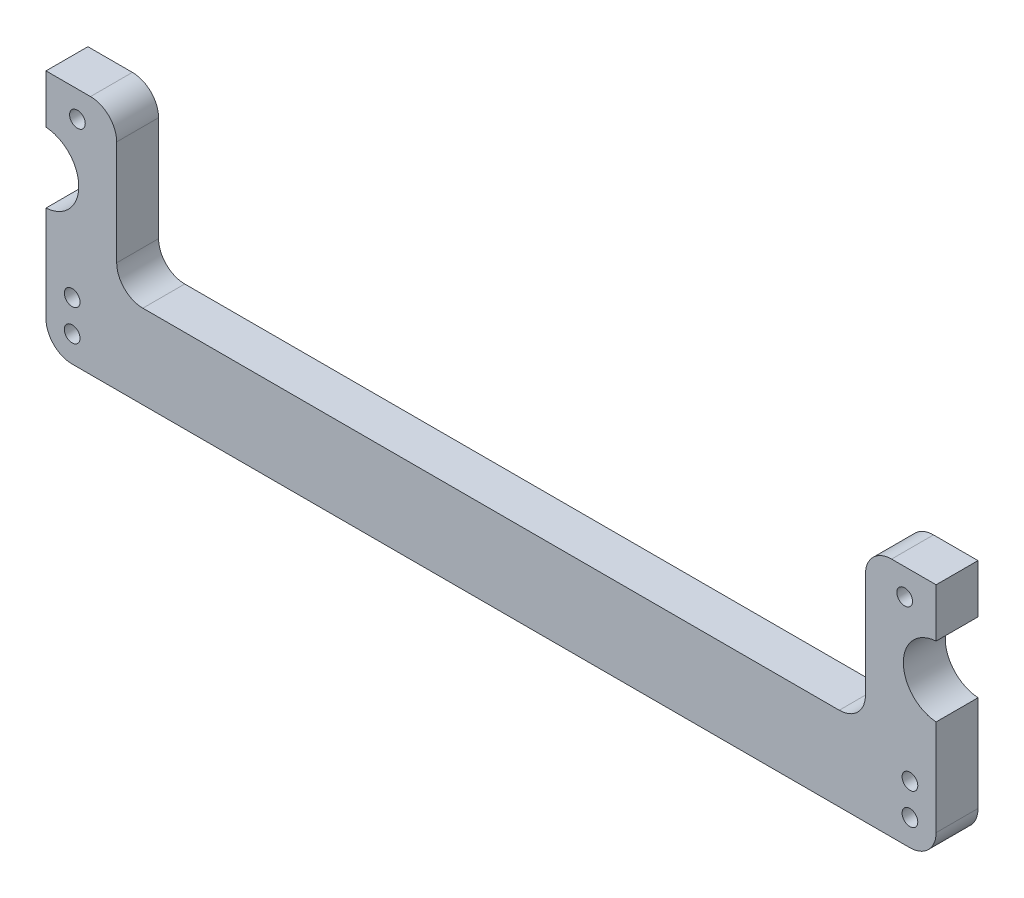
ISO-10303-21;
HEADER;
FILE_DESCRIPTION(('STEP AP214'),'2;1');
FILE_NAME('part.step','',(''),(''),'','','');
FILE_SCHEMA(('AUTOMOTIVE_DESIGN { 1 0 10303 214 1 1 1 1 }'));
ENDSEC;
DATA;
#1=APPLICATION_CONTEXT('core data for automotive mechanical design processes');
#2=APPLICATION_PROTOCOL_DEFINITION('international standard','automotive_design',2000,#1);
#3=PRODUCT_CONTEXT('',#1,'mechanical');
#4=PRODUCT('Part','Part','',(#3));
#5=PRODUCT_RELATED_PRODUCT_CATEGORY('part','',(#4));
#6=PRODUCT_DEFINITION_FORMATION('','',#4);
#7=PRODUCT_DEFINITION_CONTEXT('part definition',#1,'design');
#8=PRODUCT_DEFINITION('design','',#6,#7);
#9=PRODUCT_DEFINITION_SHAPE('','',#8);
#10=(LENGTH_UNIT() NAMED_UNIT(*) SI_UNIT(.MILLI.,.METRE.));
#11=(NAMED_UNIT(*) PLANE_ANGLE_UNIT() SI_UNIT($,.RADIAN.));
#12=(NAMED_UNIT(*) SI_UNIT($,.STERADIAN.) SOLID_ANGLE_UNIT());
#13=UNCERTAINTY_MEASURE_WITH_UNIT(LENGTH_MEASURE(1.E-05),#10,'distance_accuracy_value','');
#14=(GEOMETRIC_REPRESENTATION_CONTEXT(3) GLOBAL_UNCERTAINTY_ASSIGNED_CONTEXT((#13)) GLOBAL_UNIT_ASSIGNED_CONTEXT((#10,
#11,#12)) REPRESENTATION_CONTEXT('',''));
#15=CARTESIAN_POINT('',(0.,0.,0.));
#16=DIRECTION('',(0.,0.,1.));
#17=DIRECTION('',(1.,0.,0.));
#18=AXIS2_PLACEMENT_3D('',#15,#16,#17);
#19=CARTESIAN_POINT('',(0.,5.00000000000004,8.));
#20=DIRECTION('',(1.,0.,0.));
#21=DIRECTION('',(0.,0.,-1.));
#22=AXIS2_PLACEMENT_3D('',#19,#20,#21);
#23=PLANE('',#22);
#24=DIRECTION('',(0.,-1.,0.));
#25=VECTOR('',#24,1.);
#26=CARTESIAN_POINT('',(0.,5.00000000000004,0.));
#27=LINE('',#26,#25);
#28=CARTESIAN_POINT('',(0.,46.,0.));
#29=VERTEX_POINT('',#28);
#30=CARTESIAN_POINT('',(0.,36.6855366276759,0.));
#31=VERTEX_POINT('',#30);
#32=EDGE_CURVE('E215',#29,#31,#27,.T.);
#33=ORIENTED_EDGE('',*,*,#32,.T.);
#34=DIRECTION('',(0.,0.,1.));
#35=VECTOR('',#34,1.);
#36=CARTESIAN_POINT('',(0.,36.6855366276759,0.));
#37=LINE('',#36,#35);
#38=CARTESIAN_POINT('',(0.,36.6855366276759,8.));
#39=VERTEX_POINT('',#38);
#40=EDGE_CURVE('E11',#31,#39,#37,.T.);
#41=ORIENTED_EDGE('',*,*,#40,.T.);
#42=DIRECTION('',(0.,-1.,0.));
#43=VECTOR('',#42,1.);
#44=CARTESIAN_POINT('',(0.,16.,8.));
#45=LINE('',#44,#43);
#46=CARTESIAN_POINT('',(0.,46.,8.));
#47=VERTEX_POINT('',#46);
#48=EDGE_CURVE('E170',#47,#39,#45,.T.);
#49=ORIENTED_EDGE('',*,*,#48,.F.);
#50=DIRECTION('',(0.,0.,-1.));
#51=VECTOR('',#50,1.);
#52=CARTESIAN_POINT('',(0.,46.,8.));
#53=LINE('',#52,#51);
#54=EDGE_CURVE('E257',#47,#29,#53,.T.);
#55=ORIENTED_EDGE('',*,*,#54,.T.);
#56=EDGE_LOOP('',(#33,#41,#49,#55));
#57=FACE_BOUND('',#56,.T.);
#58=ADVANCED_FACE('F34',(#57),#23,.F.);
#59=CARTESIAN_POINT('',(170.,16.,8.));
#60=DIRECTION('',(-1.,0.,0.));
#61=DIRECTION('',(0.,0.,1.));
#62=AXIS2_PLACEMENT_3D('',#59,#60,#61);
#63=PLANE('',#62);
#64=DIRECTION('',(0.,1.,0.));
#65=VECTOR('',#64,1.);
#66=CARTESIAN_POINT('',(170.,16.,0.));
#67=LINE('',#66,#65);
#68=CARTESIAN_POINT('',(170.,5.00000000000004,0.));
#69=VERTEX_POINT('',#68);
#70=CARTESIAN_POINT('',(170.,23.3144633723235,0.));
#71=VERTEX_POINT('',#70);
#72=EDGE_CURVE('E226',#69,#71,#67,.T.);
#73=ORIENTED_EDGE('',*,*,#72,.T.);
#74=DIRECTION('',(0.,0.,1.));
#75=VECTOR('',#74,1.);
#76=CARTESIAN_POINT('',(170.,23.3144633723235,0.));
#77=LINE('',#76,#75);
#78=CARTESIAN_POINT('',(170.,23.3144633723235,8.));
#79=VERTEX_POINT('',#78);
#80=EDGE_CURVE('E162',#71,#79,#77,.T.);
#81=ORIENTED_EDGE('',*,*,#80,.T.);
#82=DIRECTION('',(0.,1.,0.));
#83=VECTOR('',#82,1.);
#84=CARTESIAN_POINT('',(170.,5.00000000000004,8.));
#85=LINE('',#84,#83);
#86=CARTESIAN_POINT('',(170.,5.00000000000004,8.));
#87=VERTEX_POINT('',#86);
#88=EDGE_CURVE('E189',#87,#79,#85,.T.);
#89=ORIENTED_EDGE('',*,*,#88,.F.);
#90=DIRECTION('',(0.,0.,-1.));
#91=VECTOR('',#90,1.);
#92=CARTESIAN_POINT('',(170.,5.00000000000004,8.));
#93=LINE('',#92,#91);
#94=EDGE_CURVE('E247',#87,#69,#93,.T.);
#95=ORIENTED_EDGE('',*,*,#94,.T.);
#96=EDGE_LOOP('',(#73,#81,#89,#95));
#97=FACE_BOUND('',#96,.T.);
#98=ADVANCED_FACE('F280',(#97),#63,.F.);
#99=CARTESIAN_POINT('',(151.5,21.,8.));
#100=DIRECTION('',(0.,0.,-1.));
#101=DIRECTION('',(-1.,0.,0.));
#102=AXIS2_PLACEMENT_3D('',#99,#100,#101);
#103=PLANE('',#102);
#104=CARTESIAN_POINT('',(6.,41.,8.));
#105=DIRECTION('',(0.,0.,1.));
#106=DIRECTION('',(1.,0.,0.));
#107=AXIS2_PLACEMENT_3D('',#104,#105,#106);
#108=CIRCLE('',#107,1.5);
#109=CARTESIAN_POINT('',(7.5,41.,8.));
#110=VERTEX_POINT('',#109);
#111=EDGE_CURVE('E309',#110,#110,#108,.T.);
#112=ORIENTED_EDGE('',*,*,#111,.F.);
#113=EDGE_LOOP('',(#112));
#114=FACE_BOUND('',#113,.T.);
#115=CARTESIAN_POINT('',(165.,5.,8.));
#116=DIRECTION('',(0.,0.,1.));
#117=DIRECTION('',(1.,0.,0.));
#118=AXIS2_PLACEMENT_3D('',#115,#116,#117);
#119=CIRCLE('',#118,1.5);
#120=CARTESIAN_POINT('',(166.5,5.,8.));
#121=VERTEX_POINT('',#120);
#122=EDGE_CURVE('E321',#121,#121,#119,.T.);
#123=ORIENTED_EDGE('',*,*,#122,.F.);
#124=EDGE_LOOP('',(#123));
#125=FACE_BOUND('',#124,.T.);
#126=CARTESIAN_POINT('',(5.,11.,8.));
#127=DIRECTION('',(0.,0.,1.));
#128=DIRECTION('',(1.,0.,0.));
#129=AXIS2_PLACEMENT_3D('',#126,#127,#128);
#130=CIRCLE('',#129,1.5);
#131=CARTESIAN_POINT('',(6.5,11.,8.));
#132=VERTEX_POINT('',#131);
#133=EDGE_CURVE('E203',#132,#132,#130,.T.);
#134=ORIENTED_EDGE('',*,*,#133,.F.);
#135=EDGE_LOOP('',(#134));
#136=FACE_BOUND('',#135,.T.);
#137=ORIENTED_EDGE('',*,*,#48,.T.);
#138=CARTESIAN_POINT('',(-0.440000000000183,29.9999999999997,8.));
#139=DIRECTION('',(0.,0.,1.));
#140=DIRECTION('',(1.,0.,0.));
#141=AXIS2_PLACEMENT_3D('',#138,#139,#140);
#142=CIRCLE('',#141,6.70000000000001);
#143=CARTESIAN_POINT('',(0.,23.3144633723235,8.));
#144=VERTEX_POINT('',#143);
#145=EDGE_CURVE('E158',#144,#39,#142,.T.);
#146=ORIENTED_EDGE('',*,*,#145,.F.);
#147=CARTESIAN_POINT('',(0.,5.00000000000004,8.));
#148=VERTEX_POINT('',#147);
#149=EDGE_CURVE('E167',#144,#148,#45,.T.);
#150=ORIENTED_EDGE('',*,*,#149,.T.);
#151=CARTESIAN_POINT('',(5.,5.,8.));
#152=DIRECTION('',(0.,0.,1.));
#153=DIRECTION('',(-1.,0.,0.));
#154=AXIS2_PLACEMENT_3D('',#151,#152,#153);
#155=CIRCLE('',#154,5.);
#156=CARTESIAN_POINT('',(5.00000000000004,0.,8.));
#157=VERTEX_POINT('',#156);
#158=EDGE_CURVE('E178',#148,#157,#155,.T.);
#159=ORIENTED_EDGE('',*,*,#158,.T.);
#160=DIRECTION('',(1.,0.,0.));
#161=VECTOR('',#160,1.);
#162=CARTESIAN_POINT('',(5.00000000000004,0.,8.));
#163=LINE('',#162,#161);
#164=CARTESIAN_POINT('',(165.,0.,8.));
#165=VERTEX_POINT('',#164);
#166=EDGE_CURVE('E184',#157,#165,#163,.T.);
#167=ORIENTED_EDGE('',*,*,#166,.T.);
#168=CARTESIAN_POINT('',(165.,5.,8.));
#169=DIRECTION('',(0.,0.,1.));
#170=DIRECTION('',(1.,0.,0.));
#171=AXIS2_PLACEMENT_3D('',#168,#169,#170);
#172=CIRCLE('',#171,5.);
#173=EDGE_CURVE('E186',#165,#87,#172,.T.);
#174=ORIENTED_EDGE('',*,*,#173,.T.);
#175=ORIENTED_EDGE('',*,*,#88,.T.);
#176=CARTESIAN_POINT('',(170.44,29.9999999999997,8.));
#177=DIRECTION('',(0.,0.,1.));
#178=DIRECTION('',(1.,0.,0.));
#179=AXIS2_PLACEMENT_3D('',#176,#177,#178);
#180=CIRCLE('',#179,6.69999999999999);
#181=CARTESIAN_POINT('',(170.,36.6855366276759,8.));
#182=VERTEX_POINT('',#181);
#183=EDGE_CURVE('E282',#182,#79,#180,.T.);
#184=ORIENTED_EDGE('',*,*,#183,.F.);
#185=CARTESIAN_POINT('',(170.,46.,8.));
#186=VERTEX_POINT('',#185);
#187=EDGE_CURVE('E188',#182,#186,#85,.T.);
#188=ORIENTED_EDGE('',*,*,#187,.T.);
#189=DIRECTION('',(-1.,0.,0.));
#190=VECTOR('',#189,1.);
#191=CARTESIAN_POINT('',(161.5,46.,8.));
#192=LINE('',#191,#190);
#193=CARTESIAN_POINT('',(161.5,46.,8.));
#194=VERTEX_POINT('',#193);
#195=EDGE_CURVE('E192',#186,#194,#192,.T.);
#196=ORIENTED_EDGE('',*,*,#195,.T.);
#197=CARTESIAN_POINT('',(161.5,41.,8.));
#198=DIRECTION('',(0.,0.,1.));
#199=DIRECTION('',(1.,0.,0.));
#200=AXIS2_PLACEMENT_3D('',#197,#198,#199);
#201=CIRCLE('',#200,5.);
#202=CARTESIAN_POINT('',(156.5,41.,8.));
#203=VERTEX_POINT('',#202);
#204=EDGE_CURVE('E194',#194,#203,#201,.T.);
#205=ORIENTED_EDGE('',*,*,#204,.T.);
#206=DIRECTION('',(0.,-1.,0.));
#207=VECTOR('',#206,1.);
#208=CARTESIAN_POINT('',(156.5,21.,8.));
#209=LINE('',#208,#207);
#210=CARTESIAN_POINT('',(156.5,21.,8.));
#211=VERTEX_POINT('',#210);
#212=EDGE_CURVE('E196',#203,#211,#209,.T.);
#213=ORIENTED_EDGE('',*,*,#212,.T.);
#214=CARTESIAN_POINT('',(151.5,21.,8.));
#215=DIRECTION('',(0.,0.,-1.));
#216=DIRECTION('',(-1.,0.,0.));
#217=AXIS2_PLACEMENT_3D('',#214,#215,#216);
#218=CIRCLE('',#217,5.);
#219=CARTESIAN_POINT('',(151.5,16.,8.));
#220=VERTEX_POINT('',#219);
#221=EDGE_CURVE('E235',#211,#220,#218,.T.);
#222=ORIENTED_EDGE('',*,*,#221,.T.);
#223=DIRECTION('',(-1.,0.,0.));
#224=VECTOR('',#223,1.);
#225=CARTESIAN_POINT('',(18.5,16.,8.));
#226=LINE('',#225,#224);
#227=CARTESIAN_POINT('',(18.5,16.,8.));
#228=VERTEX_POINT('',#227);
#229=EDGE_CURVE('E339',#220,#228,#226,.T.);
#230=ORIENTED_EDGE('',*,*,#229,.T.);
#231=CARTESIAN_POINT('',(18.5,21.,8.));
#232=DIRECTION('',(0.,0.,-1.));
#233=DIRECTION('',(-1.,0.,0.));
#234=AXIS2_PLACEMENT_3D('',#231,#232,#233);
#235=CIRCLE('',#234,5.);
#236=CARTESIAN_POINT('',(13.5,21.,8.));
#237=VERTEX_POINT('',#236);
#238=EDGE_CURVE('E341',#228,#237,#235,.T.);
#239=ORIENTED_EDGE('',*,*,#238,.T.);
#240=DIRECTION('',(0.,1.,0.));
#241=VECTOR('',#240,1.);
#242=CARTESIAN_POINT('',(13.5,21.,8.));
#243=LINE('',#242,#241);
#244=CARTESIAN_POINT('',(13.5,41.,8.));
#245=VERTEX_POINT('',#244);
#246=EDGE_CURVE('E343',#237,#245,#243,.T.);
#247=ORIENTED_EDGE('',*,*,#246,.T.);
#248=CARTESIAN_POINT('',(8.50000000000001,41.,8.));
#249=DIRECTION('',(0.,0.,1.));
#250=DIRECTION('',(1.,0.,0.));
#251=AXIS2_PLACEMENT_3D('',#248,#249,#250);
#252=CIRCLE('',#251,5.);
#253=CARTESIAN_POINT('',(8.49999999999998,46.,8.));
#254=VERTEX_POINT('',#253);
#255=EDGE_CURVE('E179',#245,#254,#252,.T.);
#256=ORIENTED_EDGE('',*,*,#255,.T.);
#257=DIRECTION('',(-1.,0.,0.));
#258=VECTOR('',#257,1.);
#259=CARTESIAN_POINT('',(8.49999999999998,46.,8.));
#260=LINE('',#259,#258);
#261=EDGE_CURVE('E176',#254,#47,#260,.T.);
#262=ORIENTED_EDGE('',*,*,#261,.T.);
#263=EDGE_LOOP('',(#137,#146,#150,#159,#167,#174,#175,#184,#188,#196,#205,#213,#222,#230,#239,
#247,#256,#262));
#264=FACE_BOUND('',#263,.T.);
#265=CARTESIAN_POINT('',(5.,5.,8.));
#266=DIRECTION('',(0.,0.,1.));
#267=DIRECTION('',(-1.,0.,0.));
#268=AXIS2_PLACEMENT_3D('',#265,#266,#267);
#269=CIRCLE('',#268,1.5);
#270=CARTESIAN_POINT('',(3.5,5.,8.));
#271=VERTEX_POINT('',#270);
#272=EDGE_CURVE('E327',#271,#271,#269,.T.);
#273=ORIENTED_EDGE('',*,*,#272,.F.);
#274=EDGE_LOOP('',(#273));
#275=FACE_BOUND('',#274,.T.);
#276=CARTESIAN_POINT('',(165.,11.,8.));
#277=DIRECTION('',(0.,0.,1.));
#278=DIRECTION('',(-1.,0.,0.));
#279=AXIS2_PLACEMENT_3D('',#276,#277,#278);
#280=CIRCLE('',#279,1.5);
#281=CARTESIAN_POINT('',(163.5,11.,8.));
#282=VERTEX_POINT('',#281);
#283=EDGE_CURVE('E315',#282,#282,#280,.T.);
#284=ORIENTED_EDGE('',*,*,#283,.F.);
#285=EDGE_LOOP('',(#284));
#286=FACE_BOUND('',#285,.T.);
#287=CARTESIAN_POINT('',(164.,41.,8.));
#288=DIRECTION('',(0.,0.,1.));
#289=DIRECTION('',(-1.,0.,0.));
#290=AXIS2_PLACEMENT_3D('',#287,#288,#289);
#291=CIRCLE('',#290,1.5);
#292=CARTESIAN_POINT('',(162.5,41.,8.));
#293=VERTEX_POINT('',#292);
#294=EDGE_CURVE('E301',#293,#293,#291,.T.);
#295=ORIENTED_EDGE('',*,*,#294,.F.);
#296=EDGE_LOOP('',(#295));
#297=FACE_BOUND('',#296,.T.);
#298=ADVANCED_FACE('F165',(#114,#125,#136,#264,#275,#286,#297),#103,.F.);
#299=CARTESIAN_POINT('',(151.5,21.,0.));
#300=DIRECTION('',(0.,0.,-1.));
#301=DIRECTION('',(-1.,0.,0.));
#302=AXIS2_PLACEMENT_3D('',#299,#300,#301);
#303=PLANE('',#302);
#304=CARTESIAN_POINT('',(-0.440000000000183,29.9999999999997,0.));
#305=DIRECTION('',(0.,0.,1.));
#306=DIRECTION('',(1.,0.,0.));
#307=AXIS2_PLACEMENT_3D('',#304,#305,#306);
#308=CIRCLE('',#307,6.70000000000001);
#309=CARTESIAN_POINT('',(0.,23.3144633723235,0.));
#310=VERTEX_POINT('',#309);
#311=EDGE_CURVE('E49',#310,#31,#308,.T.);
#312=ORIENTED_EDGE('',*,*,#311,.T.);
#313=ORIENTED_EDGE('',*,*,#32,.F.);
#314=DIRECTION('',(-1.,0.,0.));
#315=VECTOR('',#314,1.);
#316=CARTESIAN_POINT('',(8.49999999999998,46.,0.));
#317=LINE('',#316,#315);
#318=CARTESIAN_POINT('',(8.49999999999998,46.,0.));
#319=VERTEX_POINT('',#318);
#320=EDGE_CURVE('E211',#319,#29,#317,.T.);
#321=ORIENTED_EDGE('',*,*,#320,.F.);
#322=CARTESIAN_POINT('',(8.50000000000001,41.,0.));
#323=DIRECTION('',(0.,0.,1.));
#324=DIRECTION('',(1.,0.,0.));
#325=AXIS2_PLACEMENT_3D('',#322,#323,#324);
#326=CIRCLE('',#325,5.);
#327=CARTESIAN_POINT('',(13.5,41.,0.));
#328=VERTEX_POINT('',#327);
#329=EDGE_CURVE('E209',#328,#319,#326,.T.);
#330=ORIENTED_EDGE('',*,*,#329,.F.);
#331=DIRECTION('',(0.,1.,0.));
#332=VECTOR('',#331,1.);
#333=CARTESIAN_POINT('',(13.5,21.,0.));
#334=LINE('',#333,#332);
#335=CARTESIAN_POINT('',(13.5,21.,0.));
#336=VERTEX_POINT('',#335);
#337=EDGE_CURVE('E207',#336,#328,#334,.T.);
#338=ORIENTED_EDGE('',*,*,#337,.F.);
#339=CARTESIAN_POINT('',(18.5,21.,0.));
#340=DIRECTION('',(0.,0.,-1.));
#341=DIRECTION('',(-1.,0.,0.));
#342=AXIS2_PLACEMENT_3D('',#339,#340,#341);
#343=CIRCLE('',#342,5.);
#344=CARTESIAN_POINT('',(18.5,16.,0.));
#345=VERTEX_POINT('',#344);
#346=EDGE_CURVE('E205',#345,#336,#343,.T.);
#347=ORIENTED_EDGE('',*,*,#346,.F.);
#348=DIRECTION('',(-1.,0.,0.));
#349=VECTOR('',#348,1.);
#350=CARTESIAN_POINT('',(18.5,16.,0.));
#351=LINE('',#350,#349);
#352=CARTESIAN_POINT('',(151.5,16.,0.));
#353=VERTEX_POINT('',#352);
#354=EDGE_CURVE('E202',#353,#345,#351,.T.);
#355=ORIENTED_EDGE('',*,*,#354,.F.);
#356=CARTESIAN_POINT('',(151.5,21.,0.));
#357=DIRECTION('',(0.,0.,-1.));
#358=DIRECTION('',(-1.,0.,0.));
#359=AXIS2_PLACEMENT_3D('',#356,#357,#358);
#360=CIRCLE('',#359,5.);
#361=CARTESIAN_POINT('',(156.5,21.,0.));
#362=VERTEX_POINT('',#361);
#363=EDGE_CURVE('E199',#362,#353,#360,.T.);
#364=ORIENTED_EDGE('',*,*,#363,.F.);
#365=DIRECTION('',(0.,-1.,0.));
#366=VECTOR('',#365,1.);
#367=CARTESIAN_POINT('',(156.5,21.,0.));
#368=LINE('',#367,#366);
#369=CARTESIAN_POINT('',(156.5,41.,0.));
#370=VERTEX_POINT('',#369);
#371=EDGE_CURVE('E233',#370,#362,#368,.T.);
#372=ORIENTED_EDGE('',*,*,#371,.F.);
#373=CARTESIAN_POINT('',(161.5,41.,0.));
#374=DIRECTION('',(0.,0.,1.));
#375=DIRECTION('',(1.,0.,0.));
#376=AXIS2_PLACEMENT_3D('',#373,#374,#375);
#377=CIRCLE('',#376,5.);
#378=CARTESIAN_POINT('',(161.5,46.,0.));
#379=VERTEX_POINT('',#378);
#380=EDGE_CURVE('E231',#379,#370,#377,.T.);
#381=ORIENTED_EDGE('',*,*,#380,.F.);
#382=DIRECTION('',(-1.,0.,0.));
#383=VECTOR('',#382,1.);
#384=CARTESIAN_POINT('',(161.5,46.,0.));
#385=LINE('',#384,#383);
#386=CARTESIAN_POINT('',(170.,46.,0.));
#387=VERTEX_POINT('',#386);
#388=EDGE_CURVE('E229',#387,#379,#385,.T.);
#389=ORIENTED_EDGE('',*,*,#388,.F.);
#390=CARTESIAN_POINT('',(170.,36.6855366276759,0.));
#391=VERTEX_POINT('',#390);
#392=EDGE_CURVE('E225',#391,#387,#67,.T.);
#393=ORIENTED_EDGE('',*,*,#392,.F.);
#394=CARTESIAN_POINT('',(170.44,29.9999999999997,0.));
#395=DIRECTION('',(0.,0.,1.));
#396=DIRECTION('',(1.,0.,0.));
#397=AXIS2_PLACEMENT_3D('',#394,#395,#396);
#398=CIRCLE('',#397,6.69999999999999);
#399=EDGE_CURVE('E57',#391,#71,#398,.T.);
#400=ORIENTED_EDGE('',*,*,#399,.T.);
#401=ORIENTED_EDGE('',*,*,#72,.F.);
#402=CARTESIAN_POINT('',(165.,5.,0.));
#403=DIRECTION('',(0.,0.,1.));
#404=DIRECTION('',(1.,0.,0.));
#405=AXIS2_PLACEMENT_3D('',#402,#403,#404);
#406=CIRCLE('',#405,5.);
#407=CARTESIAN_POINT('',(165.,0.,0.));
#408=VERTEX_POINT('',#407);
#409=EDGE_CURVE('E222',#408,#69,#406,.T.);
#410=ORIENTED_EDGE('',*,*,#409,.F.);
#411=DIRECTION('',(1.,0.,0.));
#412=VECTOR('',#411,1.);
#413=CARTESIAN_POINT('',(5.00000000000004,0.,0.));
#414=LINE('',#413,#412);
#415=CARTESIAN_POINT('',(5.00000000000004,0.,0.));
#416=VERTEX_POINT('',#415);
#417=EDGE_CURVE('E220',#416,#408,#414,.T.);
#418=ORIENTED_EDGE('',*,*,#417,.F.);
#419=CARTESIAN_POINT('',(5.,5.,0.));
#420=DIRECTION('',(0.,0.,1.));
#421=DIRECTION('',(-1.,0.,0.));
#422=AXIS2_PLACEMENT_3D('',#419,#420,#421);
#423=CIRCLE('',#422,5.);
#424=CARTESIAN_POINT('',(0.,5.00000000000004,0.));
#425=VERTEX_POINT('',#424);
#426=EDGE_CURVE('E218',#425,#416,#423,.T.);
#427=ORIENTED_EDGE('',*,*,#426,.F.);
#428=EDGE_CURVE('E214',#310,#425,#27,.T.);
#429=ORIENTED_EDGE('',*,*,#428,.F.);
#430=EDGE_LOOP('',(#312,#313,#321,#330,#338,#347,#355,#364,#372,#381,#389,#393,#400,#401,#410,
#418,#427,#429));
#431=FACE_BOUND('',#430,.T.);
#432=CARTESIAN_POINT('',(6.,41.,0.));
#433=DIRECTION('',(0.,0.,1.));
#434=DIRECTION('',(1.,0.,0.));
#435=AXIS2_PLACEMENT_3D('',#432,#433,#434);
#436=CIRCLE('',#435,1.5);
#437=CARTESIAN_POINT('',(7.5,41.,0.));
#438=VERTEX_POINT('',#437);
#439=EDGE_CURVE('E307',#438,#438,#436,.T.);
#440=ORIENTED_EDGE('',*,*,#439,.T.);
#441=EDGE_LOOP('',(#440));
#442=FACE_BOUND('',#441,.T.);
#443=CARTESIAN_POINT('',(165.,5.,0.));
#444=DIRECTION('',(0.,0.,1.));
#445=DIRECTION('',(1.,0.,0.));
#446=AXIS2_PLACEMENT_3D('',#443,#444,#445);
#447=CIRCLE('',#446,1.5);
#448=CARTESIAN_POINT('',(166.5,5.,0.));
#449=VERTEX_POINT('',#448);
#450=EDGE_CURVE('E318',#449,#449,#447,.T.);
#451=ORIENTED_EDGE('',*,*,#450,.T.);
#452=EDGE_LOOP('',(#451));
#453=FACE_BOUND('',#452,.T.);
#454=CARTESIAN_POINT('',(5.,11.,0.));
#455=DIRECTION('',(0.,0.,1.));
#456=DIRECTION('',(1.,0.,0.));
#457=AXIS2_PLACEMENT_3D('',#454,#455,#456);
#458=CIRCLE('',#457,1.5);
#459=CARTESIAN_POINT('',(6.5,11.,0.));
#460=VERTEX_POINT('',#459);
#461=EDGE_CURVE('E330',#460,#460,#458,.T.);
#462=ORIENTED_EDGE('',*,*,#461,.T.);
#463=EDGE_LOOP('',(#462));
#464=FACE_BOUND('',#463,.T.);
#465=CARTESIAN_POINT('',(5.,5.,0.));
#466=DIRECTION('',(0.,0.,1.));
#467=DIRECTION('',(-1.,0.,0.));
#468=AXIS2_PLACEMENT_3D('',#465,#466,#467);
#469=CIRCLE('',#468,1.5);
#470=CARTESIAN_POINT('',(3.5,5.,0.));
#471=VERTEX_POINT('',#470);
#472=EDGE_CURVE('E324',#471,#471,#469,.T.);
#473=ORIENTED_EDGE('',*,*,#472,.T.);
#474=EDGE_LOOP('',(#473));
#475=FACE_BOUND('',#474,.T.);
#476=CARTESIAN_POINT('',(165.,11.,0.));
#477=DIRECTION('',(0.,0.,1.));
#478=DIRECTION('',(-1.,0.,0.));
#479=AXIS2_PLACEMENT_3D('',#476,#477,#478);
#480=CIRCLE('',#479,1.5);
#481=CARTESIAN_POINT('',(163.5,11.,0.));
#482=VERTEX_POINT('',#481);
#483=EDGE_CURVE('E312',#482,#482,#480,.T.);
#484=ORIENTED_EDGE('',*,*,#483,.T.);
#485=EDGE_LOOP('',(#484));
#486=FACE_BOUND('',#485,.T.);
#487=CARTESIAN_POINT('',(164.,41.,0.));
#488=DIRECTION('',(0.,0.,1.));
#489=DIRECTION('',(-1.,0.,0.));
#490=AXIS2_PLACEMENT_3D('',#487,#488,#489);
#491=CIRCLE('',#490,1.5);
#492=CARTESIAN_POINT('',(162.5,41.,0.));
#493=VERTEX_POINT('',#492);
#494=EDGE_CURVE('E298',#493,#493,#491,.T.);
#495=ORIENTED_EDGE('',*,*,#494,.T.);
#496=EDGE_LOOP('',(#495));
#497=FACE_BOUND('',#496,.T.);
#498=ADVANCED_FACE('F293',(#431,#442,#453,#464,#475,#486,#497),#303,.T.);
#499=CARTESIAN_POINT('',(151.5,21.,8.));
#500=DIRECTION('',(0.,0.,-1.));
#501=DIRECTION('',(-1.,0.,0.));
#502=AXIS2_PLACEMENT_3D('',#499,#500,#501);
#503=CYLINDRICAL_SURFACE('',#502,5.);
#504=ORIENTED_EDGE('',*,*,#363,.T.);
#505=DIRECTION('',(0.,0.,-1.));
#506=VECTOR('',#505,1.);
#507=CARTESIAN_POINT('',(151.5,16.,8.));
#508=LINE('',#507,#506);
#509=EDGE_CURVE('E272',#220,#353,#508,.T.);
#510=ORIENTED_EDGE('',*,*,#509,.F.);
#511=ORIENTED_EDGE('',*,*,#221,.F.);
#512=DIRECTION('',(0.,0.,-1.));
#513=VECTOR('',#512,1.);
#514=CARTESIAN_POINT('',(156.5,21.,8.));
#515=LINE('',#514,#513);
#516=EDGE_CURVE('E198',#211,#362,#515,.T.);
#517=ORIENTED_EDGE('',*,*,#516,.T.);
#518=EDGE_LOOP('',(#504,#510,#511,#517));
#519=FACE_BOUND('',#518,.T.);
#520=ADVANCED_FACE('F36',(#519),#503,.F.);
#521=CARTESIAN_POINT('',(18.5,16.,8.));
#522=DIRECTION('',(0.,-1.,0.));
#523=DIRECTION('',(0.,0.,-1.));
#524=AXIS2_PLACEMENT_3D('',#521,#522,#523);
#525=PLANE('',#524);
#526=ORIENTED_EDGE('',*,*,#354,.T.);
#527=DIRECTION('',(0.,0.,-1.));
#528=VECTOR('',#527,1.);
#529=CARTESIAN_POINT('',(18.5,16.,8.));
#530=LINE('',#529,#528);
#531=EDGE_CURVE('E269',#228,#345,#530,.T.);
#532=ORIENTED_EDGE('',*,*,#531,.F.);
#533=ORIENTED_EDGE('',*,*,#229,.F.);
#534=ORIENTED_EDGE('',*,*,#509,.T.);
#535=EDGE_LOOP('',(#526,#532,#533,#534));
#536=FACE_BOUND('',#535,.T.);
#537=ADVANCED_FACE('F393',(#536),#525,.F.);
#538=CARTESIAN_POINT('',(18.5,21.,8.));
#539=DIRECTION('',(0.,0.,-1.));
#540=DIRECTION('',(-1.,0.,0.));
#541=AXIS2_PLACEMENT_3D('',#538,#539,#540);
#542=CYLINDRICAL_SURFACE('',#541,5.);
#543=ORIENTED_EDGE('',*,*,#346,.T.);
#544=DIRECTION('',(0.,0.,-1.));
#545=VECTOR('',#544,1.);
#546=CARTESIAN_POINT('',(13.5,21.,8.));
#547=LINE('',#546,#545);
#548=EDGE_CURVE('E266',#237,#336,#547,.T.);
#549=ORIENTED_EDGE('',*,*,#548,.F.);
#550=ORIENTED_EDGE('',*,*,#238,.F.);
#551=ORIENTED_EDGE('',*,*,#531,.T.);
#552=EDGE_LOOP('',(#543,#549,#550,#551));
#553=FACE_BOUND('',#552,.T.);
#554=ADVANCED_FACE('F390',(#553),#542,.F.);
#555=CARTESIAN_POINT('',(13.5,21.,8.));
#556=DIRECTION('',(-1.,0.,0.));
#557=DIRECTION('',(0.,0.,1.));
#558=AXIS2_PLACEMENT_3D('',#555,#556,#557);
#559=PLANE('',#558);
#560=ORIENTED_EDGE('',*,*,#337,.T.);
#561=DIRECTION('',(0.,0.,-1.));
#562=VECTOR('',#561,1.);
#563=CARTESIAN_POINT('',(13.5,41.,8.));
#564=LINE('',#563,#562);
#565=EDGE_CURVE('E263',#245,#328,#564,.T.);
#566=ORIENTED_EDGE('',*,*,#565,.F.);
#567=ORIENTED_EDGE('',*,*,#246,.F.);
#568=ORIENTED_EDGE('',*,*,#548,.T.);
#569=EDGE_LOOP('',(#560,#566,#567,#568));
#570=FACE_BOUND('',#569,.T.);
#571=ADVANCED_FACE('F385',(#570),#559,.F.);
#572=CARTESIAN_POINT('',(8.50000000000001,41.,8.));
#573=DIRECTION('',(0.,0.,-1.));
#574=DIRECTION('',(-1.,0.,0.));
#575=AXIS2_PLACEMENT_3D('',#572,#573,#574);
#576=CYLINDRICAL_SURFACE('',#575,5.);
#577=ORIENTED_EDGE('',*,*,#329,.T.);
#578=DIRECTION('',(0.,0.,-1.));
#579=VECTOR('',#578,1.);
#580=CARTESIAN_POINT('',(8.49999999999998,46.,8.));
#581=LINE('',#580,#579);
#582=EDGE_CURVE('E260',#254,#319,#581,.T.);
#583=ORIENTED_EDGE('',*,*,#582,.F.);
#584=ORIENTED_EDGE('',*,*,#255,.F.);
#585=ORIENTED_EDGE('',*,*,#565,.T.);
#586=EDGE_LOOP('',(#577,#583,#584,#585));
#587=FACE_BOUND('',#586,.T.);
#588=ADVANCED_FACE('F351',(#587),#576,.T.);
#589=CARTESIAN_POINT('',(8.49999999999998,46.,8.));
#590=DIRECTION('',(0.,-1.,0.));
#591=DIRECTION('',(0.,0.,-1.));
#592=AXIS2_PLACEMENT_3D('',#589,#590,#591);
#593=PLANE('',#592);
#594=ORIENTED_EDGE('',*,*,#320,.T.);
#595=ORIENTED_EDGE('',*,*,#54,.F.);
#596=ORIENTED_EDGE('',*,*,#261,.F.);
#597=ORIENTED_EDGE('',*,*,#582,.T.);
#598=EDGE_LOOP('',(#594,#595,#596,#597));
#599=FACE_BOUND('',#598,.T.);
#600=ADVANCED_FACE('F355',(#599),#593,.F.);
#601=ORIENTED_EDGE('',*,*,#149,.F.);
#602=DIRECTION('',(0.,0.,1.));
#603=VECTOR('',#602,1.);
#604=CARTESIAN_POINT('',(0.,23.3144633723235,0.));
#605=LINE('',#604,#603);
#606=EDGE_CURVE('E42',#144,#310,#605,.F.);
#607=ORIENTED_EDGE('',*,*,#606,.T.);
#608=ORIENTED_EDGE('',*,*,#428,.T.);
#609=DIRECTION('',(0.,0.,-1.));
#610=VECTOR('',#609,1.);
#611=CARTESIAN_POINT('',(0.,5.00000000000004,8.));
#612=LINE('',#611,#610);
#613=EDGE_CURVE('E174',#148,#425,#612,.T.);
#614=ORIENTED_EDGE('',*,*,#613,.F.);
#615=EDGE_LOOP('',(#601,#607,#608,#614));
#616=FACE_BOUND('',#615,.T.);
#617=ADVANCED_FACE('F172',(#616),#23,.F.);
#618=CARTESIAN_POINT('',(5.,5.,8.));
#619=DIRECTION('',(0.,0.,-1.));
#620=DIRECTION('',(-1.,0.,0.));
#621=AXIS2_PLACEMENT_3D('',#618,#619,#620);
#622=CYLINDRICAL_SURFACE('',#621,5.);
#623=ORIENTED_EDGE('',*,*,#426,.T.);
#624=DIRECTION('',(0.,0.,-1.));
#625=VECTOR('',#624,1.);
#626=CARTESIAN_POINT('',(5.00000000000004,0.,8.));
#627=LINE('',#626,#625);
#628=EDGE_CURVE('E253',#157,#416,#627,.T.);
#629=ORIENTED_EDGE('',*,*,#628,.F.);
#630=ORIENTED_EDGE('',*,*,#158,.F.);
#631=ORIENTED_EDGE('',*,*,#613,.T.);
#632=EDGE_LOOP('',(#623,#629,#630,#631));
#633=FACE_BOUND('',#632,.T.);
#634=ADVANCED_FACE('F358',(#633),#622,.T.);
#635=CARTESIAN_POINT('',(5.00000000000004,0.,8.));
#636=DIRECTION('',(0.,1.,0.));
#637=DIRECTION('',(0.,0.,1.));
#638=AXIS2_PLACEMENT_3D('',#635,#636,#637);
#639=PLANE('',#638);
#640=ORIENTED_EDGE('',*,*,#417,.T.);
#641=DIRECTION('',(0.,0.,-1.));
#642=VECTOR('',#641,1.);
#643=CARTESIAN_POINT('',(165.,0.,8.));
#644=LINE('',#643,#642);
#645=EDGE_CURVE('E250',#165,#408,#644,.T.);
#646=ORIENTED_EDGE('',*,*,#645,.F.);
#647=ORIENTED_EDGE('',*,*,#166,.F.);
#648=ORIENTED_EDGE('',*,*,#628,.T.);
#649=EDGE_LOOP('',(#640,#646,#647,#648));
#650=FACE_BOUND('',#649,.T.);
#651=ADVANCED_FACE('F361',(#650),#639,.F.);
#652=CARTESIAN_POINT('',(165.,5.,8.));
#653=DIRECTION('',(0.,0.,-1.));
#654=DIRECTION('',(-1.,0.,0.));
#655=AXIS2_PLACEMENT_3D('',#652,#653,#654);
#656=CYLINDRICAL_SURFACE('',#655,5.);
#657=ORIENTED_EDGE('',*,*,#409,.T.);
#658=ORIENTED_EDGE('',*,*,#94,.F.);
#659=ORIENTED_EDGE('',*,*,#173,.F.);
#660=ORIENTED_EDGE('',*,*,#645,.T.);
#661=EDGE_LOOP('',(#657,#658,#659,#660));
#662=FACE_BOUND('',#661,.T.);
#663=ADVANCED_FACE('F289',(#662),#656,.T.);
#664=ORIENTED_EDGE('',*,*,#187,.F.);
#665=DIRECTION('',(0.,0.,1.));
#666=VECTOR('',#665,1.);
#667=CARTESIAN_POINT('',(170.,36.6855366276759,0.));
#668=LINE('',#667,#666);
#669=EDGE_CURVE('E275',#182,#391,#668,.F.);
#670=ORIENTED_EDGE('',*,*,#669,.T.);
#671=ORIENTED_EDGE('',*,*,#392,.T.);
#672=DIRECTION('',(0.,0.,-1.));
#673=VECTOR('',#672,1.);
#674=CARTESIAN_POINT('',(170.,46.,8.));
#675=LINE('',#674,#673);
#676=EDGE_CURVE('E244',#186,#387,#675,.T.);
#677=ORIENTED_EDGE('',*,*,#676,.F.);
#678=EDGE_LOOP('',(#664,#670,#671,#677));
#679=FACE_BOUND('',#678,.T.);
#680=ADVANCED_FACE('F368',(#679),#63,.F.);
#681=CARTESIAN_POINT('',(161.5,46.,8.));
#682=DIRECTION('',(0.,-1.,0.));
#683=DIRECTION('',(0.,0.,-1.));
#684=AXIS2_PLACEMENT_3D('',#681,#682,#683);
#685=PLANE('',#684);
#686=ORIENTED_EDGE('',*,*,#388,.T.);
#687=DIRECTION('',(0.,0.,-1.));
#688=VECTOR('',#687,1.);
#689=CARTESIAN_POINT('',(161.5,46.,8.));
#690=LINE('',#689,#688);
#691=EDGE_CURVE('E241',#194,#379,#690,.T.);
#692=ORIENTED_EDGE('',*,*,#691,.F.);
#693=ORIENTED_EDGE('',*,*,#195,.F.);
#694=ORIENTED_EDGE('',*,*,#676,.T.);
#695=EDGE_LOOP('',(#686,#692,#693,#694));
#696=FACE_BOUND('',#695,.T.);
#697=ADVANCED_FACE('F422',(#696),#685,.F.);
#698=CARTESIAN_POINT('',(161.5,41.,8.));
#699=DIRECTION('',(0.,0.,-1.));
#700=DIRECTION('',(-1.,0.,0.));
#701=AXIS2_PLACEMENT_3D('',#698,#699,#700);
#702=CYLINDRICAL_SURFACE('',#701,5.);
#703=ORIENTED_EDGE('',*,*,#380,.T.);
#704=DIRECTION('',(0.,0.,-1.));
#705=VECTOR('',#704,1.);
#706=CARTESIAN_POINT('',(156.5,41.,8.));
#707=LINE('',#706,#705);
#708=EDGE_CURVE('E238',#203,#370,#707,.T.);
#709=ORIENTED_EDGE('',*,*,#708,.F.);
#710=ORIENTED_EDGE('',*,*,#204,.F.);
#711=ORIENTED_EDGE('',*,*,#691,.T.);
#712=EDGE_LOOP('',(#703,#709,#710,#711));
#713=FACE_BOUND('',#712,.T.);
#714=ADVANCED_FACE('F418',(#713),#702,.T.);
#715=CARTESIAN_POINT('',(156.5,21.,8.));
#716=DIRECTION('',(1.,0.,0.));
#717=DIRECTION('',(0.,0.,-1.));
#718=AXIS2_PLACEMENT_3D('',#715,#716,#717);
#719=PLANE('',#718);
#720=ORIENTED_EDGE('',*,*,#371,.T.);
#721=ORIENTED_EDGE('',*,*,#516,.F.);
#722=ORIENTED_EDGE('',*,*,#212,.F.);
#723=ORIENTED_EDGE('',*,*,#708,.T.);
#724=EDGE_LOOP('',(#720,#721,#722,#723));
#725=FACE_BOUND('',#724,.T.);
#726=ADVANCED_FACE('F414',(#725),#719,.F.);
#727=CARTESIAN_POINT('',(5.,11.,8.));
#728=DIRECTION('',(0.,0.,-1.));
#729=DIRECTION('',(-1.,0.,0.));
#730=AXIS2_PLACEMENT_3D('',#727,#728,#729);
#731=CYLINDRICAL_SURFACE('',#730,1.5);
#732=ORIENTED_EDGE('',*,*,#133,.T.);
#733=EDGE_LOOP('',(#732));
#734=FACE_BOUND('',#733,.T.);
#735=ORIENTED_EDGE('',*,*,#461,.F.);
#736=EDGE_LOOP('',(#735));
#737=FACE_BOUND('',#736,.T.);
#738=ADVANCED_FACE('F452',(#734,#737),#731,.F.);
#739=CARTESIAN_POINT('',(5.,5.,8.));
#740=DIRECTION('',(0.,0.,-1.));
#741=DIRECTION('',(-1.,0.,0.));
#742=AXIS2_PLACEMENT_3D('',#739,#740,#741);
#743=CYLINDRICAL_SURFACE('',#742,1.5);
#744=ORIENTED_EDGE('',*,*,#272,.T.);
#745=EDGE_LOOP('',(#744));
#746=FACE_BOUND('',#745,.T.);
#747=ORIENTED_EDGE('',*,*,#472,.F.);
#748=EDGE_LOOP('',(#747));
#749=FACE_BOUND('',#748,.T.);
#750=ADVANCED_FACE('F448',(#746,#749),#743,.F.);
#751=CARTESIAN_POINT('',(165.,5.,8.));
#752=DIRECTION('',(0.,0.,-1.));
#753=DIRECTION('',(-1.,0.,0.));
#754=AXIS2_PLACEMENT_3D('',#751,#752,#753);
#755=CYLINDRICAL_SURFACE('',#754,1.5);
#756=ORIENTED_EDGE('',*,*,#122,.T.);
#757=EDGE_LOOP('',(#756));
#758=FACE_BOUND('',#757,.T.);
#759=ORIENTED_EDGE('',*,*,#450,.F.);
#760=EDGE_LOOP('',(#759));
#761=FACE_BOUND('',#760,.T.);
#762=ADVANCED_FACE('F444',(#758,#761),#755,.F.);
#763=CARTESIAN_POINT('',(165.,11.,8.));
#764=DIRECTION('',(0.,0.,-1.));
#765=DIRECTION('',(-1.,0.,0.));
#766=AXIS2_PLACEMENT_3D('',#763,#764,#765);
#767=CYLINDRICAL_SURFACE('',#766,1.5);
#768=ORIENTED_EDGE('',*,*,#283,.T.);
#769=EDGE_LOOP('',(#768));
#770=FACE_BOUND('',#769,.T.);
#771=ORIENTED_EDGE('',*,*,#483,.F.);
#772=EDGE_LOOP('',(#771));
#773=FACE_BOUND('',#772,.T.);
#774=ADVANCED_FACE('F440',(#770,#773),#767,.F.);
#775=CARTESIAN_POINT('',(6.,41.,8.));
#776=DIRECTION('',(0.,0.,-1.));
#777=DIRECTION('',(-1.,0.,0.));
#778=AXIS2_PLACEMENT_3D('',#775,#776,#777);
#779=CYLINDRICAL_SURFACE('',#778,1.5);
#780=ORIENTED_EDGE('',*,*,#111,.T.);
#781=EDGE_LOOP('',(#780));
#782=FACE_BOUND('',#781,.T.);
#783=ORIENTED_EDGE('',*,*,#439,.F.);
#784=EDGE_LOOP('',(#783));
#785=FACE_BOUND('',#784,.T.);
#786=ADVANCED_FACE('F434',(#782,#785),#779,.F.);
#787=CARTESIAN_POINT('',(164.,41.,8.));
#788=DIRECTION('',(0.,0.,-1.));
#789=DIRECTION('',(-1.,0.,0.));
#790=AXIS2_PLACEMENT_3D('',#787,#788,#789);
#791=CYLINDRICAL_SURFACE('',#790,1.5);
#792=ORIENTED_EDGE('',*,*,#294,.T.);
#793=EDGE_LOOP('',(#792));
#794=FACE_BOUND('',#793,.T.);
#795=ORIENTED_EDGE('',*,*,#494,.F.);
#796=EDGE_LOOP('',(#795));
#797=FACE_BOUND('',#796,.T.);
#798=ADVANCED_FACE('F427',(#794,#797),#791,.F.);
#799=CARTESIAN_POINT('',(170.44,29.9999999999997,0.));
#800=DIRECTION('',(0.,0.,1.));
#801=DIRECTION('',(1.,0.,0.));
#802=AXIS2_PLACEMENT_3D('',#799,#800,#801);
#803=CYLINDRICAL_SURFACE('',#802,6.69999999999999);
#804=ORIENTED_EDGE('',*,*,#399,.F.);
#805=ORIENTED_EDGE('',*,*,#669,.F.);
#806=ORIENTED_EDGE('',*,*,#183,.T.);
#807=ORIENTED_EDGE('',*,*,#80,.F.);
#808=EDGE_LOOP('',(#804,#805,#806,#807));
#809=FACE_BOUND('',#808,.T.);
#810=ADVANCED_FACE('F425',(#809),#803,.F.);
#811=CARTESIAN_POINT('',(-0.440000000000183,29.9999999999997,0.));
#812=DIRECTION('',(0.,0.,1.));
#813=DIRECTION('',(1.,0.,0.));
#814=AXIS2_PLACEMENT_3D('',#811,#812,#813);
#815=CYLINDRICAL_SURFACE('',#814,6.70000000000001);
#816=ORIENTED_EDGE('',*,*,#311,.F.);
#817=ORIENTED_EDGE('',*,*,#606,.F.);
#818=ORIENTED_EDGE('',*,*,#145,.T.);
#819=ORIENTED_EDGE('',*,*,#40,.F.);
#820=EDGE_LOOP('',(#816,#817,#818,#819));
#821=FACE_BOUND('',#820,.T.);
#822=ADVANCED_FACE('F157',(#821),#815,.F.);
#823=CLOSED_SHELL('',(#58,#98,#298,#498,#520,#537,#554,#571,#588,#600,#617,#634,#651,#663,#680,
#697,#714,#726,#738,#750,#762,#774,#786,#798,#810,#822));
#824=MANIFOLD_SOLID_BREP('B2',#823);
#825=ADVANCED_BREP_SHAPE_REPRESENTATION('',(#18,#824),#14);
#826=SHAPE_DEFINITION_REPRESENTATION(#9,#825);
ENDSEC;
END-ISO-10303-21;
